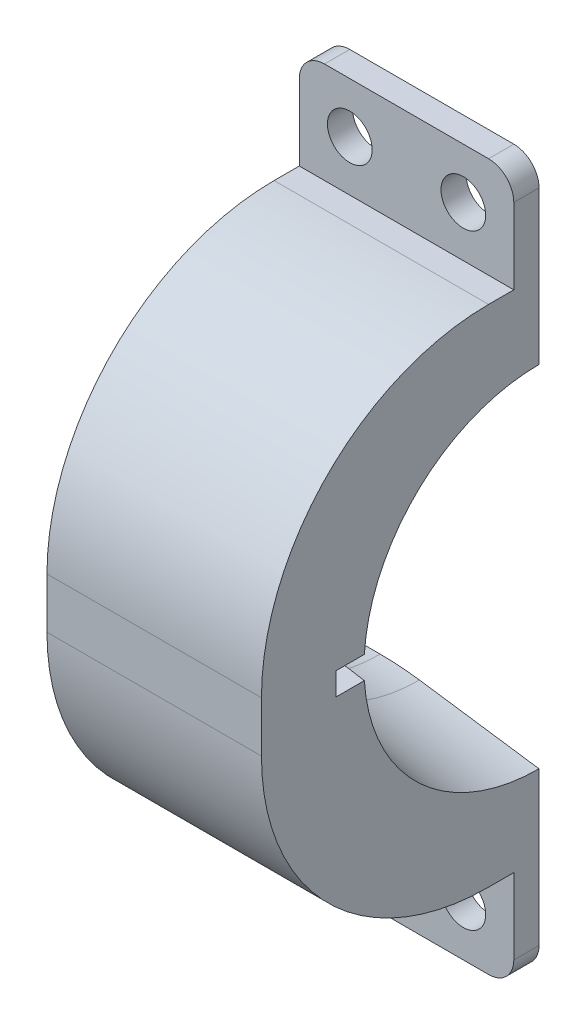
ISO-10303-21;
HEADER;
FILE_DESCRIPTION(('STEP AP214'),'2;1');
FILE_NAME('part.step','',(''),(''),'','','');
FILE_SCHEMA(('AUTOMOTIVE_DESIGN { 1 0 10303 214 1 1 1 1 }'));
ENDSEC;
DATA;
#1=APPLICATION_CONTEXT('core data for automotive mechanical design processes');
#2=APPLICATION_PROTOCOL_DEFINITION('international standard','automotive_design',2000,#1);
#3=PRODUCT_CONTEXT('',#1,'mechanical');
#4=PRODUCT('Part','Part','',(#3));
#5=PRODUCT_RELATED_PRODUCT_CATEGORY('part','',(#4));
#6=PRODUCT_DEFINITION_FORMATION('','',#4);
#7=PRODUCT_DEFINITION_CONTEXT('part definition',#1,'design');
#8=PRODUCT_DEFINITION('design','',#6,#7);
#9=PRODUCT_DEFINITION_SHAPE('','',#8);
#10=(LENGTH_UNIT() NAMED_UNIT(*) SI_UNIT(.MILLI.,.METRE.));
#11=(NAMED_UNIT(*) PLANE_ANGLE_UNIT() SI_UNIT($,.RADIAN.));
#12=(NAMED_UNIT(*) SI_UNIT($,.STERADIAN.) SOLID_ANGLE_UNIT());
#13=UNCERTAINTY_MEASURE_WITH_UNIT(LENGTH_MEASURE(1.E-05),#10,'distance_accuracy_value','');
#14=(GEOMETRIC_REPRESENTATION_CONTEXT(3) GLOBAL_UNCERTAINTY_ASSIGNED_CONTEXT((#13)) GLOBAL_UNIT_ASSIGNED_CONTEXT((#10,
#11,#12)) REPRESENTATION_CONTEXT('',''));
#15=CARTESIAN_POINT('',(0.,0.,0.));
#16=DIRECTION('',(0.,0.,1.));
#17=DIRECTION('',(1.,0.,0.));
#18=AXIS2_PLACEMENT_3D('',#15,#16,#17);
#19=CARTESIAN_POINT('',(4.46967704467682,25.4,27.94));
#20=DIRECTION('',(0.,-1.,0.));
#21=DIRECTION('',(1.,0.,0.));
#22=AXIS2_PLACEMENT_3D('',#19,#20,#21);
#23=PLANE('',#22);
#24=DIRECTION('',(-1.,0.,0.));
#25=VECTOR('',#24,1.);
#26=CARTESIAN_POINT('',(-89.5103229553232,25.4,2.54));
#27=LINE('',#26,#25);
#28=CARTESIAN_POINT('',(-67.9203229553232,25.4,2.54));
#29=VERTEX_POINT('',#28);
#30=CARTESIAN_POINT('',(-89.5103229553232,25.4,2.54));
#31=VERTEX_POINT('',#30);
#32=EDGE_CURVE('E390',#29,#31,#27,.T.);
#33=ORIENTED_EDGE('',*,*,#32,.T.);
#34=DIRECTION('',(0.,0.,-1.));
#35=VECTOR('',#34,1.);
#36=CARTESIAN_POINT('',(-89.5103229553232,25.4,27.94));
#37=LINE('',#36,#35);
#38=CARTESIAN_POINT('',(-89.5103229553232,25.4,5.08));
#39=VERTEX_POINT('',#38);
#40=EDGE_CURVE('E229',#39,#31,#37,.T.);
#41=ORIENTED_EDGE('',*,*,#40,.F.);
#42=DIRECTION('',(-1.,0.,0.));
#43=VECTOR('',#42,1.);
#44=CARTESIAN_POINT('',(4.46967704467682,25.4,5.08));
#45=LINE('',#44,#43);
#46=CARTESIAN_POINT('',(-67.9203229553232,25.4,5.08));
#47=VERTEX_POINT('',#46);
#48=EDGE_CURVE('E250',#39,#47,#45,.F.);
#49=ORIENTED_EDGE('',*,*,#48,.T.);
#50=DIRECTION('',(0.,0.,-1.));
#51=VECTOR('',#50,1.);
#52=CARTESIAN_POINT('',(-67.9203229553232,25.4,27.94));
#53=LINE('',#52,#51);
#54=EDGE_CURVE('E224',#47,#29,#53,.T.);
#55=ORIENTED_EDGE('',*,*,#54,.T.);
#56=EDGE_LOOP('',(#33,#41,#49,#55));
#57=FACE_BOUND('',#56,.T.);
#58=ADVANCED_FACE('F40',(#57),#23,.F.);
#59=CARTESIAN_POINT('',(0.,0.,0.));
#60=DIRECTION('',(0.,0.,-1.));
#61=DIRECTION('',(-1.,0.,0.));
#62=AXIS2_PLACEMENT_3D('',#59,#60,#61);
#63=PLANE('',#62);
#64=DIRECTION('',(0.989949493661167,0.141421356237309,0.));
#65=VECTOR('',#64,1.);
#66=CARTESIAN_POINT('',(-191.26581,0.,0.));
#67=LINE('',#66,#65);
#68=CARTESIAN_POINT('',(-67.9203229553232,17.6207838635253,0.));
#69=VERTEX_POINT('',#68);
#70=CARTESIAN_POINT('',(-79.9531319702509,15.901811147107,0.));
#71=VERTEX_POINT('',#70);
#72=EDGE_CURVE('E234',#69,#71,#67,.F.);
#73=ORIENTED_EDGE('',*,*,#72,.T.);
#74=CARTESIAN_POINT('',(-83.9044446635213,43.561,0.));
#75=DIRECTION('',(0.,0.,-1.));
#76=DIRECTION('',(-1.,0.,0.));
#77=AXIS2_PLACEMENT_3D('',#74,#75,#76);
#78=CIRCLE('',#77,27.94);
#79=CARTESIAN_POINT('',(-83.9044446635213,15.621,0.));
#80=VERTEX_POINT('',#79);
#81=EDGE_CURVE('E11',#71,#80,#78,.T.);
#82=ORIENTED_EDGE('',*,*,#81,.T.);
#83=DIRECTION('',(-1.,0.,0.));
#84=VECTOR('',#83,1.);
#85=CARTESIAN_POINT('',(-74.2703229553232,15.621,0.));
#86=LINE('',#85,#84);
#87=CARTESIAN_POINT('',(-89.5103229553232,15.621,0.));
#88=VERTEX_POINT('',#87);
#89=EDGE_CURVE('E198',#88,#80,#86,.F.);
#90=ORIENTED_EDGE('',*,*,#89,.F.);
#91=DIRECTION('',(0.,-1.,0.));
#92=VECTOR('',#91,1.);
#93=CARTESIAN_POINT('',(-89.5103229553232,25.4,0.));
#94=LINE('',#93,#92);
#95=CARTESIAN_POINT('',(-89.5103229553232,33.02,0.));
#96=VERTEX_POINT('',#95);
#97=EDGE_CURVE('E209',#96,#88,#94,.T.);
#98=ORIENTED_EDGE('',*,*,#97,.F.);
#99=CARTESIAN_POINT('',(-86.9703229553232,33.02,0.));
#100=DIRECTION('',(0.,0.,-1.));
#101=DIRECTION('',(-1.,0.,0.));
#102=AXIS2_PLACEMENT_3D('',#99,#100,#101);
#103=CIRCLE('',#102,2.54);
#104=CARTESIAN_POINT('',(-86.9703229553232,35.56,0.));
#105=VERTEX_POINT('',#104);
#106=EDGE_CURVE('E285',#96,#105,#103,.T.);
#107=ORIENTED_EDGE('',*,*,#106,.T.);
#108=DIRECTION('',(1.,0.,0.));
#109=VECTOR('',#108,1.);
#110=CARTESIAN_POINT('',(-89.5103229553232,35.56,0.));
#111=LINE('',#110,#109);
#112=CARTESIAN_POINT('',(-70.4603229553232,35.56,0.));
#113=VERTEX_POINT('',#112);
#114=EDGE_CURVE('E372',#105,#113,#111,.T.);
#115=ORIENTED_EDGE('',*,*,#114,.T.);
#116=CARTESIAN_POINT('',(-70.4603229553232,33.02,0.));
#117=DIRECTION('',(0.,0.,-1.));
#118=DIRECTION('',(-1.,0.,0.));
#119=AXIS2_PLACEMENT_3D('',#116,#117,#118);
#120=CIRCLE('',#119,2.54);
#121=CARTESIAN_POINT('',(-67.9203229553232,33.02,0.));
#122=VERTEX_POINT('',#121);
#123=EDGE_CURVE('E287',#113,#122,#120,.T.);
#124=ORIENTED_EDGE('',*,*,#123,.T.);
#125=DIRECTION('',(0.,1.,0.));
#126=VECTOR('',#125,1.);
#127=CARTESIAN_POINT('',(-67.9203229553232,25.4,0.));
#128=LINE('',#127,#126);
#129=EDGE_CURVE('E392',#69,#122,#128,.T.);
#130=ORIENTED_EDGE('',*,*,#129,.F.);
#131=EDGE_LOOP('',(#73,#82,#90,#98,#107,#115,#124,#130));
#132=FACE_BOUND('',#131,.T.);
#133=CARTESIAN_POINT('',(-73.0003229553232,30.48,0.));
#134=DIRECTION('',(0.,0.,1.));
#135=DIRECTION('',(1.,0.,0.));
#136=AXIS2_PLACEMENT_3D('',#133,#134,#135);
#137=CIRCLE('',#136,2.249999945);
#138=CARTESIAN_POINT('',(-70.7503230103232,30.48,0.));
#139=VERTEX_POINT('',#138);
#140=EDGE_CURVE('E355',#139,#139,#137,.T.);
#141=ORIENTED_EDGE('',*,*,#140,.T.);
#142=EDGE_LOOP('',(#141));
#143=FACE_BOUND('',#142,.T.);
#144=CARTESIAN_POINT('',(-84.4303229553232,30.48,0.));
#145=DIRECTION('',(0.,0.,1.));
#146=DIRECTION('',(1.,0.,0.));
#147=AXIS2_PLACEMENT_3D('',#144,#145,#146);
#148=CIRCLE('',#147,2.249999945);
#149=CARTESIAN_POINT('',(-82.1803230103232,30.48,0.));
#150=VERTEX_POINT('',#149);
#151=EDGE_CURVE('E363',#150,#150,#148,.T.);
#152=ORIENTED_EDGE('',*,*,#151,.T.);
#153=EDGE_LOOP('',(#152));
#154=FACE_BOUND('',#153,.T.);
#155=ADVANCED_FACE('F207',(#132,#143,#154),#63,.T.);
#156=DIRECTION('',(-1.,0.,0.));
#157=VECTOR('',#156,1.);
#158=CARTESIAN_POINT('',(-74.2703229553232,-15.621,0.));
#159=LINE('',#158,#157);
#160=CARTESIAN_POINT('',(-83.9044446635213,-15.621,0.));
#161=VERTEX_POINT('',#160);
#162=CARTESIAN_POINT('',(-89.5103229553232,-15.621,0.));
#163=VERTEX_POINT('',#162);
#164=EDGE_CURVE('E200',#161,#163,#159,.T.);
#165=ORIENTED_EDGE('',*,*,#164,.F.);
#166=CARTESIAN_POINT('',(-83.9044446635213,-43.561,0.));
#167=DIRECTION('',(0.,0.,-1.));
#168=DIRECTION('',(-1.,0.,0.));
#169=AXIS2_PLACEMENT_3D('',#166,#167,#168);
#170=CIRCLE('',#169,27.94);
#171=CARTESIAN_POINT('',(-79.9531319702509,-15.901811147107,0.));
#172=VERTEX_POINT('',#171);
#173=EDGE_CURVE('E62',#161,#172,#170,.T.);
#174=ORIENTED_EDGE('',*,*,#173,.T.);
#175=DIRECTION('',(-0.989949493661167,0.141421356237309,0.));
#176=VECTOR('',#175,1.);
#177=CARTESIAN_POINT('',(-191.26581,0.,0.));
#178=LINE('',#177,#176);
#179=CARTESIAN_POINT('',(-67.9203229553232,-17.6207838635253,0.));
#180=VERTEX_POINT('',#179);
#181=EDGE_CURVE('E232',#172,#180,#178,.F.);
#182=ORIENTED_EDGE('',*,*,#181,.T.);
#183=CARTESIAN_POINT('',(-67.9203229553232,-33.02,0.));
#184=VERTEX_POINT('',#183);
#185=EDGE_CURVE('E399',#184,#180,#128,.T.);
#186=ORIENTED_EDGE('',*,*,#185,.F.);
#187=CARTESIAN_POINT('',(-70.4603229553232,-33.02,0.));
#188=DIRECTION('',(0.,0.,-1.));
#189=DIRECTION('',(-1.,0.,0.));
#190=AXIS2_PLACEMENT_3D('',#187,#188,#189);
#191=CIRCLE('',#190,2.54);
#192=CARTESIAN_POINT('',(-70.4603229553232,-35.56,0.));
#193=VERTEX_POINT('',#192);
#194=EDGE_CURVE('E263',#184,#193,#191,.T.);
#195=ORIENTED_EDGE('',*,*,#194,.T.);
#196=DIRECTION('',(-1.,0.,0.));
#197=VECTOR('',#196,1.);
#198=CARTESIAN_POINT('',(-89.5103229553232,-35.56,0.));
#199=LINE('',#198,#197);
#200=CARTESIAN_POINT('',(-86.9703229553232,-35.56,0.));
#201=VERTEX_POINT('',#200);
#202=EDGE_CURVE('E369',#193,#201,#199,.T.);
#203=ORIENTED_EDGE('',*,*,#202,.T.);
#204=CARTESIAN_POINT('',(-86.9703229553232,-33.02,0.));
#205=DIRECTION('',(0.,0.,-1.));
#206=DIRECTION('',(-1.,0.,0.));
#207=AXIS2_PLACEMENT_3D('',#204,#205,#206);
#208=CIRCLE('',#207,2.54);
#209=CARTESIAN_POINT('',(-89.5103229553232,-33.02,0.));
#210=VERTEX_POINT('',#209);
#211=EDGE_CURVE('E265',#201,#210,#208,.T.);
#212=ORIENTED_EDGE('',*,*,#211,.T.);
#213=EDGE_CURVE('E219',#163,#210,#94,.T.);
#214=ORIENTED_EDGE('',*,*,#213,.F.);
#215=EDGE_LOOP('',(#165,#174,#182,#186,#195,#203,#212,#214));
#216=FACE_BOUND('',#215,.T.);
#217=CARTESIAN_POINT('',(-84.4303229553232,-30.48,0.));
#218=DIRECTION('',(0.,0.,1.));
#219=DIRECTION('',(1.,0.,0.));
#220=AXIS2_PLACEMENT_3D('',#217,#218,#219);
#221=CIRCLE('',#220,2.249999945);
#222=CARTESIAN_POINT('',(-82.1803230103232,-30.48,0.));
#223=VERTEX_POINT('',#222);
#224=EDGE_CURVE('E348',#223,#223,#221,.T.);
#225=ORIENTED_EDGE('',*,*,#224,.T.);
#226=EDGE_LOOP('',(#225));
#227=FACE_BOUND('',#226,.T.);
#228=CARTESIAN_POINT('',(-73.0003229553232,-30.48,0.));
#229=DIRECTION('',(0.,0.,1.));
#230=DIRECTION('',(1.,0.,0.));
#231=AXIS2_PLACEMENT_3D('',#228,#229,#230);
#232=CIRCLE('',#231,2.249999945);
#233=CARTESIAN_POINT('',(-70.7503230103232,-30.48,0.));
#234=VERTEX_POINT('',#233);
#235=EDGE_CURVE('E344',#234,#234,#232,.T.);
#236=ORIENTED_EDGE('',*,*,#235,.T.);
#237=EDGE_LOOP('',(#236));
#238=FACE_BOUND('',#237,.T.);
#239=ADVANCED_FACE('F454',(#216,#227,#238),#63,.T.);
#240=CARTESIAN_POINT('',(-89.5103229553232,25.4,27.94));
#241=DIRECTION('',(1.,0.,0.));
#242=DIRECTION('',(0.,0.,-1.));
#243=AXIS2_PLACEMENT_3D('',#240,#241,#242);
#244=PLANE('',#243);
#245=ORIENTED_EDGE('',*,*,#97,.T.);
#246=CARTESIAN_POINT('',(-89.5103229553232,0.,0.));
#247=DIRECTION('',(-1.,0.,0.));
#248=DIRECTION('',(0.,0.,1.));
#249=AXIS2_PLACEMENT_3D('',#246,#247,#248);
#250=CIRCLE('',#249,15.621);
#251=EDGE_CURVE('E194',#163,#88,#250,.T.);
#252=ORIENTED_EDGE('',*,*,#251,.F.);
#253=ORIENTED_EDGE('',*,*,#213,.T.);
#254=DIRECTION('',(0.,0.,-1.));
#255=VECTOR('',#254,1.);
#256=CARTESIAN_POINT('',(-89.5103229553232,-33.02,2.54));
#257=LINE('',#256,#255);
#258=CARTESIAN_POINT('',(-89.5103229553232,-33.02,2.54));
#259=VERTEX_POINT('',#258);
#260=EDGE_CURVE('E269',#210,#259,#257,.F.);
#261=ORIENTED_EDGE('',*,*,#260,.T.);
#262=DIRECTION('',(0.,1.,0.));
#263=VECTOR('',#262,1.);
#264=CARTESIAN_POINT('',(-89.5103229553232,-25.4,2.54));
#265=LINE('',#264,#263);
#266=CARTESIAN_POINT('',(-89.5103229553232,-25.4,2.54));
#267=VERTEX_POINT('',#266);
#268=EDGE_CURVE('E373',#259,#267,#265,.T.);
#269=ORIENTED_EDGE('',*,*,#268,.T.);
#270=DIRECTION('',(0.,0.,-1.));
#271=VECTOR('',#270,1.);
#272=CARTESIAN_POINT('',(-89.5103229553232,-25.4,27.94));
#273=LINE('',#272,#271);
#274=CARTESIAN_POINT('',(-89.5103229553232,-25.4,5.08));
#275=VERTEX_POINT('',#274);
#276=EDGE_CURVE('E222',#275,#267,#273,.T.);
#277=ORIENTED_EDGE('',*,*,#276,.F.);
#278=CARTESIAN_POINT('',(-89.5103229553232,-2.53999999999999,5.08));
#279=DIRECTION('',(1.,0.,0.));
#280=DIRECTION('',(0.,0.,-1.));
#281=AXIS2_PLACEMENT_3D('',#278,#279,#280);
#282=CIRCLE('',#281,22.86);
#283=CARTESIAN_POINT('',(-89.5103229553232,-2.53999999999999,27.94));
#284=VERTEX_POINT('',#283);
#285=EDGE_CURVE('E246',#275,#284,#282,.F.);
#286=ORIENTED_EDGE('',*,*,#285,.T.);
#287=DIRECTION('',(0.,-1.,0.));
#288=VECTOR('',#287,1.);
#289=CARTESIAN_POINT('',(-89.5103229553232,25.4,27.94));
#290=LINE('',#289,#288);
#291=CARTESIAN_POINT('',(-89.5103229553232,2.53999999999999,27.94));
#292=VERTEX_POINT('',#291);
#293=EDGE_CURVE('E218',#292,#284,#290,.T.);
#294=ORIENTED_EDGE('',*,*,#293,.F.);
#295=CARTESIAN_POINT('',(-89.5103229553232,2.53999999999999,5.08));
#296=DIRECTION('',(1.,0.,0.));
#297=DIRECTION('',(0.,0.,-1.));
#298=AXIS2_PLACEMENT_3D('',#295,#296,#297);
#299=CIRCLE('',#298,22.86);
#300=EDGE_CURVE('E248',#292,#39,#299,.F.);
#301=ORIENTED_EDGE('',*,*,#300,.T.);
#302=ORIENTED_EDGE('',*,*,#40,.T.);
#303=DIRECTION('',(0.,1.,0.));
#304=VECTOR('',#303,1.);
#305=CARTESIAN_POINT('',(-89.5103229553232,25.4,2.54));
#306=LINE('',#305,#304);
#307=CARTESIAN_POINT('',(-89.5103229553232,33.02,2.54));
#308=VERTEX_POINT('',#307);
#309=EDGE_CURVE('E383',#31,#308,#306,.T.);
#310=ORIENTED_EDGE('',*,*,#309,.T.);
#311=DIRECTION('',(0.,0.,-1.));
#312=VECTOR('',#311,1.);
#313=CARTESIAN_POINT('',(-89.5103229553232,33.02,0.));
#314=LINE('',#313,#312);
#315=EDGE_CURVE('E217',#308,#96,#314,.T.);
#316=ORIENTED_EDGE('',*,*,#315,.T.);
#317=EDGE_LOOP('',(#245,#252,#253,#261,#269,#277,#286,#294,#301,#302,#310,#316));
#318=FACE_BOUND('',#317,.T.);
#319=ADVANCED_FACE('F214',(#318),#244,.F.);
#320=CARTESIAN_POINT('',(4.46967704467682,-25.4,27.94));
#321=DIRECTION('',(0.,1.,0.));
#322=DIRECTION('',(-1.,0.,0.));
#323=AXIS2_PLACEMENT_3D('',#320,#321,#322);
#324=PLANE('',#323);
#325=ORIENTED_EDGE('',*,*,#276,.T.);
#326=DIRECTION('',(1.,0.,0.));
#327=VECTOR('',#326,1.);
#328=CARTESIAN_POINT('',(-89.5103229553232,-25.4,2.54));
#329=LINE('',#328,#327);
#330=CARTESIAN_POINT('',(-67.9203229553232,-25.4,2.54));
#331=VERTEX_POINT('',#330);
#332=EDGE_CURVE('E379',#267,#331,#329,.T.);
#333=ORIENTED_EDGE('',*,*,#332,.T.);
#334=DIRECTION('',(0.,0.,-1.));
#335=VECTOR('',#334,1.);
#336=CARTESIAN_POINT('',(-67.9203229553232,-25.4,27.94));
#337=LINE('',#336,#335);
#338=CARTESIAN_POINT('',(-67.9203229553232,-25.4,5.08));
#339=VERTEX_POINT('',#338);
#340=EDGE_CURVE('E398',#339,#331,#337,.T.);
#341=ORIENTED_EDGE('',*,*,#340,.F.);
#342=DIRECTION('',(1.,0.,0.));
#343=VECTOR('',#342,1.);
#344=CARTESIAN_POINT('',(4.46967704467682,-25.4,5.08));
#345=LINE('',#344,#343);
#346=EDGE_CURVE('E256',#339,#275,#345,.F.);
#347=ORIENTED_EDGE('',*,*,#346,.T.);
#348=EDGE_LOOP('',(#325,#333,#341,#347));
#349=FACE_BOUND('',#348,.T.);
#350=ADVANCED_FACE('F412',(#349),#324,.F.);
#351=CARTESIAN_POINT('',(0.,0.,27.94));
#352=DIRECTION('',(0.,0.,-1.));
#353=DIRECTION('',(-1.,0.,0.));
#354=AXIS2_PLACEMENT_3D('',#351,#352,#353);
#355=PLANE('',#354);
#356=DIRECTION('',(0.,1.,0.));
#357=VECTOR('',#356,1.);
#358=CARTESIAN_POINT('',(-67.9203229553232,25.4,27.94));
#359=LINE('',#358,#357);
#360=CARTESIAN_POINT('',(-67.9203229553232,-2.53999999999999,27.94));
#361=VERTEX_POINT('',#360);
#362=CARTESIAN_POINT('',(-67.9203229553232,2.53999999999999,27.94));
#363=VERTEX_POINT('',#362);
#364=EDGE_CURVE('E395',#361,#363,#359,.T.);
#365=ORIENTED_EDGE('',*,*,#364,.T.);
#366=DIRECTION('',(-1.,0.,0.));
#367=VECTOR('',#366,1.);
#368=CARTESIAN_POINT('',(0.,2.54,27.94));
#369=LINE('',#368,#367);
#370=EDGE_CURVE('E243',#363,#292,#369,.T.);
#371=ORIENTED_EDGE('',*,*,#370,.T.);
#372=ORIENTED_EDGE('',*,*,#293,.T.);
#373=DIRECTION('',(1.,0.,0.));
#374=VECTOR('',#373,1.);
#375=CARTESIAN_POINT('',(0.,-2.53999999999998,27.94));
#376=LINE('',#375,#374);
#377=EDGE_CURVE('E240',#284,#361,#376,.T.);
#378=ORIENTED_EDGE('',*,*,#377,.T.);
#379=EDGE_LOOP('',(#365,#371,#372,#378));
#380=FACE_BOUND('',#379,.T.);
#381=ADVANCED_FACE('F421',(#380),#355,.F.);
#382=CARTESIAN_POINT('',(-66.58356,0.,0.));
#383=DIRECTION('',(1.,0.,0.));
#384=DIRECTION('',(0.,1.,0.));
#385=AXIS2_PLACEMENT_3D('',#382,#383,#384);
#386=CONICAL_SURFACE('',#385,17.81175,0.141897054604164);
#387=ORIENTED_EDGE('',*,*,#181,.F.);
#388=CARTESIAN_POINT('',(-79.9531319702509,0.,0.));
#389=DIRECTION('',(1.,0.,0.));
#390=DIRECTION('',(0.,0.,-1.));
#391=AXIS2_PLACEMENT_3D('',#388,#389,#390);
#392=CIRCLE('',#391,15.901811147107);
#393=EDGE_CURVE('E48',#172,#71,#392,.F.);
#394=ORIENTED_EDGE('',*,*,#393,.T.);
#395=ORIENTED_EDGE('',*,*,#72,.F.);
#396=CARTESIAN_POINT('',(-67.9203229553232,0.,0.));
#397=DIRECTION('',(-1.,0.,0.));
#398=DIRECTION('',(0.,0.,1.));
#399=AXIS2_PLACEMENT_3D('',#396,#397,#398);
#400=CIRCLE('',#399,17.6207838635253);
#401=CARTESIAN_POINT('',(-67.9203229553232,1.143,17.5836735344203));
#402=VERTEX_POINT('',#401);
#403=EDGE_CURVE('E236',#402,#69,#400,.T.);
#404=ORIENTED_EDGE('',*,*,#403,.F.);
#405=CARTESIAN_POINT('',(-83.2279578981373,1.143,15.3915968895991));
#406=CARTESIAN_POINT('',(-79.3954465580823,1.143,15.9405804529348));
#407=CARTESIAN_POINT('',(-75.5629183974125,1.143,16.4894465385013));
#408=CARTESIAN_POINT('',(-67.8978284355364,1.143,17.5869437539965));
#409=CARTESIAN_POINT('',(-64.06526663433,1.143,18.1355748839253));
#410=CARTESIAN_POINT('',(-60.232688012509,1.143,18.6840885360849));
#411=B_SPLINE_CURVE_WITH_KNOTS('',3,(#405,#406,#407,#408,#409,#410),.UNSPECIFIED.,.F.,.F.,(4,2,
4),(0.,11.6148927993291,23.2297855965587),.UNSPECIFIED.);
#412=CARTESIAN_POINT('',(-74.7572716366464,1.143,16.6047838635253));
#413=VERTEX_POINT('',#412);
#414=EDGE_CURVE('E335',#413,#402,#411,.T.);
#415=ORIENTED_EDGE('',*,*,#414,.F.);
#416=CARTESIAN_POINT('',(-59.9646093955334,-8.72456275684632,16.6047838635253));
#417=CARTESIAN_POINT('',(-60.532181859697,-8.5501494566992,16.6047838635253));
#418=CARTESIAN_POINT('',(-61.0986817662019,-8.37214656604443,16.6047838635253));
#419=CARTESIAN_POINT('',(-62.2292223817507,-8.0070788906224,16.6047838635253));
#420=CARTESIAN_POINT('',(-62.793260905193,-7.82000734971015,16.6047838635253));
#421=CARTESIAN_POINT('',(-63.9303722312166,-7.43084256601658,16.6047838635253));
#422=CARTESIAN_POINT('',(-64.5033622099753,-7.2285058179676,16.6047838635253));
#423=CARTESIAN_POINT('',(-65.6439432474748,-6.81003310760305,16.6047838635253));
#424=CARTESIAN_POINT('',(-66.2115370996438,-6.59390478827498,16.6047838635253));
#425=CARTESIAN_POINT('',(-67.3398943476994,-6.14382660849172,16.6047838635253));
#426=CARTESIAN_POINT('',(-67.90065578822,-5.90987177906268,16.6047838635253));
#427=CARTESIAN_POINT('',(-68.734394462788,-5.54091204332956,16.6047838635253));
#428=CARTESIAN_POINT('',(-69.0113095588567,-5.41480407416728,16.6047838635253));
#429=CARTESIAN_POINT('',(-69.5618030566032,-5.15552336237338,16.6047838635253));
#430=CARTESIAN_POINT('',(-69.8353817130917,-5.02235116345984,16.6047838635253));
#431=CARTESIAN_POINT('',(-70.3764926952824,-4.74845614266283,16.6047838635253));
#432=CARTESIAN_POINT('',(-70.6440529622423,-4.60778877497455,16.6047838635253));
#433=CARTESIAN_POINT('',(-71.1735613374838,-4.31631125101994,16.6047838635253));
#434=CARTESIAN_POINT('',(-71.4355106275148,-4.16550325876347,16.6047838635253));
#435=CARTESIAN_POINT('',(-71.951060697169,-3.85164706521854,16.6047838635253));
#436=CARTESIAN_POINT('',(-72.2046819586016,-3.68863273061136,16.6047838635253));
#437=CARTESIAN_POINT('',(-72.7008423873873,-3.34665338156591,16.6047838635253));
#438=CARTESIAN_POINT('',(-72.9433910346777,-3.16770241411387,16.6047838635253));
#439=CARTESIAN_POINT('',(-73.3100564716272,-2.87096147789526,16.6047838635253));
#440=CARTESIAN_POINT('',(-73.4399244686291,-2.76029600167749,16.6047838635253));
#441=CARTESIAN_POINT('',(-73.6925799273337,-2.5309165577937,16.6047838635253));
#442=CARTESIAN_POINT('',(-73.8153626803032,-2.41219734920446,16.6047838635253));
#443=CARTESIAN_POINT('',(-74.0505023788271,-2.16619584513233,16.6047838635253));
#444=CARTESIAN_POINT('',(-74.1629208498636,-2.03897302207926,16.6047838635253));
#445=CARTESIAN_POINT('',(-74.3744604317863,-1.77402761073172,16.6047838635253));
#446=CARTESIAN_POINT('',(-74.4736007750056,-1.63632067175317,16.6047838635253));
#447=CARTESIAN_POINT('',(-74.6448947929535,-1.3630062400353,16.6047838635253));
#448=CARTESIAN_POINT('',(-74.7187263423468,-1.22846885887791,16.6047838635253));
#449=CARTESIAN_POINT('',(-74.8462964867971,-0.950003540602077,16.6047838635253));
#450=CARTESIAN_POINT('',(-74.9000426511227,-0.806079165080103,16.6047838635253));
#451=CARTESIAN_POINT('',(-74.9823460411115,-0.509221875512442,16.6047838635253));
#452=CARTESIAN_POINT('',(-75.0106157294259,-0.356206409558587,16.6047838635253));
#453=CARTESIAN_POINT('',(-75.03684459256,-0.0476137957336035,16.6047838635253));
#454=CARTESIAN_POINT('',(-75.034829797829,0.107961037384871,16.6047838635253));
#455=CARTESIAN_POINT('',(-75.0028629599449,0.398045155240693,16.6047838635253));
#456=CARTESIAN_POINT('',(-74.9761291431074,0.53293040167164,16.6047838635253));
#457=CARTESIAN_POINT('',(-74.902213798534,0.796894550030227,16.6047838635253));
#458=CARTESIAN_POINT('',(-74.8550210314963,0.925970217330864,16.6047838635253));
#459=CARTESIAN_POINT('',(-74.7129084613026,1.2473006689138,16.6047838635253));
#460=CARTESIAN_POINT('',(-74.6060758242616,1.4342298980958,16.6047838635253));
#461=CARTESIAN_POINT('',(-74.3655588132459,1.78995417585098,16.6047838635253));
#462=CARTESIAN_POINT('',(-74.2317837972137,1.95868497552008,16.6047838635253));
#463=CARTESIAN_POINT('',(-73.911996654208,2.31949814731429,16.6047838635253));
#464=CARTESIAN_POINT('',(-73.7211955513063,2.50726703566679,16.6047838635253));
#465=CARTESIAN_POINT('',(-73.3225272636101,2.86396333290063,16.6047838635253));
#466=CARTESIAN_POINT('',(-73.1146280872249,3.03285396007724,16.6047838635253));
#467=CARTESIAN_POINT('',(-72.685063096019,3.35768784984228,16.6047838635253));
#468=CARTESIAN_POINT('',(-72.4632600723588,3.51344762480291,16.6047838635253));
#469=CARTESIAN_POINT('',(-72.0119436467254,3.81271919706478,16.6047838635253));
#470=CARTESIAN_POINT('',(-71.7824381092486,3.95624298746796,16.6047838635253));
#471=CARTESIAN_POINT('',(-71.3145099118267,4.23542557084644,16.6047838635253));
#472=CARTESIAN_POINT('',(-71.0760086302249,4.37095173546933,16.6047838635253));
#473=CARTESIAN_POINT('',(-70.5945034242228,4.63378543024079,16.6047838635253));
#474=CARTESIAN_POINT('',(-70.3514988409375,4.76109174531517,16.6047838635253));
#475=CARTESIAN_POINT('',(-69.6170176868855,5.13291200792459,16.6047838635253));
#476=CARTESIAN_POINT('',(-69.1203511732301,5.36716679151515,16.6047838635253));
#477=CARTESIAN_POINT('',(-68.1163489730882,5.81655277795707,16.6047838635253));
#478=CARTESIAN_POINT('',(-67.6089801682028,6.0316086920941,16.6047838635253));
#479=CARTESIAN_POINT('',(-66.5881778718693,6.44621731960819,16.6047838635253));
#480=CARTESIAN_POINT('',(-66.0747465057889,6.64577529052715,16.6047838635253));
#481=CARTESIAN_POINT('',(-65.0965118061986,7.01270851495886,16.6047838635253));
#482=CARTESIAN_POINT('',(-64.6321541209329,7.18128032888108,16.6047838635253));
#483=CARTESIAN_POINT('',(-63.7005056721534,7.51025363044038,16.6047838635253));
#484=CARTESIAN_POINT('',(-63.2332146073994,7.67065426300315,16.6047838635253));
#485=CARTESIAN_POINT('',(-62.3000449867373,7.9832969539693,16.6047838635253));
#486=CARTESIAN_POINT('',(-61.8341846798986,8.13559368358751,16.6047838635253));
#487=CARTESIAN_POINT('',(-60.9006688618731,8.43427436080144,16.6047838635253));
#488=CARTESIAN_POINT('',(-60.4330137125063,8.58065943793976,16.6047838635253));
#489=CARTESIAN_POINT('',(-59.9646093955333,8.72456275684632,16.6047838635253));
#490=B_SPLINE_CURVE_WITH_KNOTS('',3,(#416,#417,#418,#419,#420,#421,#422,#423,#424,#425,#426,
#427,#428,#429,#430,#431,#432,#433,#434,#435,#436,#437,#438,#439,#440,#441,#442,#443,#444,#445,
#446,#447,#448,#449,#450,#451,#452,#453,#454,#455,#456,#457,#458,#459,#460,#461,#462,#463,#464,
#465,#466,#467,#468,#469,#470,#471,#472,#473,#474,#475,#476,#477,#478,#479,#480,#481,#482,#483,
#484,#485,#486,#487,#488,#489),.UNSPECIFIED.,.F.,.F.,(4,2,2,2,2,2,2,2,2,2,2,2,2,2,2,2,2,2,2,2,2,
2,2,2,2,2,2,2,2,2,2,2,2,2,2,2,4),(0.,1.78132999382055,3.56400810912257,5.38685645502716,
7.20870324669594,9.03105973211113,9.94381708137555,10.8565042793797,11.7631854835898,
12.6696738122897,13.5737341585323,14.4770053823339,14.9886228503211,15.5005765049085,
16.0092635120904,16.5172055683322,16.9763319778409,17.4352851885766,17.8993557071776,
18.3630273656516,18.7737229624604,19.1846444649343,19.8268267816431,20.4712068043921,
21.2724403595673,22.0752087554608,22.8877893630715,23.6995641367138,24.5223181699142,
25.3451935470865,26.991904335983,28.644812453868,30.2971573652148,31.7790986719503,
33.261194739395,34.7315218100017,36.2015666022409),.UNSPECIFIED.);
#491=CARTESIAN_POINT('',(-74.7572716366464,-1.143,16.6047838635253));
#492=VERTEX_POINT('',#491);
#493=EDGE_CURVE('E296',#492,#413,#490,.T.);
#494=ORIENTED_EDGE('',*,*,#493,.F.);
#495=CARTESIAN_POINT('',(-60.232688012509,-1.143,18.6840885360849));
#496=CARTESIAN_POINT('',(-64.06526663433,-1.143,18.1355748839253));
#497=CARTESIAN_POINT('',(-67.8978284355364,-1.143,17.5869437539965));
#498=CARTESIAN_POINT('',(-75.5629183974125,-1.143,16.4894465385013));
#499=CARTESIAN_POINT('',(-79.3954465580823,-1.143,15.9405804529348));
#500=CARTESIAN_POINT('',(-83.2279578981373,-1.143,15.3915968895991));
#501=B_SPLINE_CURVE_WITH_KNOTS('',3,(#495,#496,#497,#498,#499,#500),.UNSPECIFIED.,.F.,.F.,(4,2,
4),(0.,11.6148927972296,23.2297855965587),.UNSPECIFIED.);
#502=CARTESIAN_POINT('',(-67.9203229553232,-1.143,17.5836735344203));
#503=VERTEX_POINT('',#502);
#504=EDGE_CURVE('E328',#503,#492,#501,.T.);
#505=ORIENTED_EDGE('',*,*,#504,.F.);
#506=EDGE_CURVE('E237',#180,#503,#400,.T.);
#507=ORIENTED_EDGE('',*,*,#506,.F.);
#508=EDGE_LOOP('',(#387,#394,#395,#404,#415,#494,#505,#507));
#509=FACE_BOUND('',#508,.T.);
#510=ADVANCED_FACE('F306',(#509),#386,.F.);
#511=CARTESIAN_POINT('',(-67.9203229553232,25.4,27.94));
#512=DIRECTION('',(-1.,0.,0.));
#513=DIRECTION('',(0.,0.,1.));
#514=AXIS2_PLACEMENT_3D('',#511,#512,#513);
#515=PLANE('',#514);
#516=DIRECTION('',(0.,-1.,0.));
#517=VECTOR('',#516,1.);
#518=CARTESIAN_POINT('',(-67.9203229553232,1.143,20.4147838635253));
#519=LINE('',#518,#517);
#520=CARTESIAN_POINT('',(-67.9203229553232,1.143,20.4147838635253));
#521=VERTEX_POINT('',#520);
#522=CARTESIAN_POINT('',(-67.9203229553232,-1.143,20.4147838635253));
#523=VERTEX_POINT('',#522);
#524=EDGE_CURVE('E211',#521,#523,#519,.T.);
#525=ORIENTED_EDGE('',*,*,#524,.F.);
#526=DIRECTION('',(0.,0.,-1.));
#527=VECTOR('',#526,1.);
#528=CARTESIAN_POINT('',(-67.9203229553232,1.143,27.94));
#529=LINE('',#528,#527);
#530=EDGE_CURVE('E293',#521,#402,#529,.T.);
#531=ORIENTED_EDGE('',*,*,#530,.T.);
#532=ORIENTED_EDGE('',*,*,#403,.T.);
#533=ORIENTED_EDGE('',*,*,#129,.T.);
#534=DIRECTION('',(0.,0.,-1.));
#535=VECTOR('',#534,1.);
#536=CARTESIAN_POINT('',(-67.9203229553232,33.02,2.54));
#537=LINE('',#536,#535);
#538=CARTESIAN_POINT('',(-67.9203229553232,33.02,2.54));
#539=VERTEX_POINT('',#538);
#540=EDGE_CURVE('E275',#122,#539,#537,.F.);
#541=ORIENTED_EDGE('',*,*,#540,.T.);
#542=DIRECTION('',(0.,-1.,0.));
#543=VECTOR('',#542,1.);
#544=CARTESIAN_POINT('',(-67.9203229553232,25.4,2.54));
#545=LINE('',#544,#543);
#546=EDGE_CURVE('E388',#539,#29,#545,.T.);
#547=ORIENTED_EDGE('',*,*,#546,.T.);
#548=ORIENTED_EDGE('',*,*,#54,.F.);
#549=CARTESIAN_POINT('',(-67.9203229553232,2.53999999999999,5.08));
#550=DIRECTION('',(-1.,0.,0.));
#551=DIRECTION('',(0.,0.,1.));
#552=AXIS2_PLACEMENT_3D('',#549,#550,#551);
#553=CIRCLE('',#552,22.86);
#554=EDGE_CURVE('E254',#47,#363,#553,.F.);
#555=ORIENTED_EDGE('',*,*,#554,.T.);
#556=ORIENTED_EDGE('',*,*,#364,.F.);
#557=CARTESIAN_POINT('',(-67.9203229553232,-2.53999999999999,5.08));
#558=DIRECTION('',(-1.,0.,0.));
#559=DIRECTION('',(0.,0.,1.));
#560=AXIS2_PLACEMENT_3D('',#557,#558,#559);
#561=CIRCLE('',#560,22.86);
#562=EDGE_CURVE('E252',#361,#339,#561,.F.);
#563=ORIENTED_EDGE('',*,*,#562,.T.);
#564=ORIENTED_EDGE('',*,*,#340,.T.);
#565=DIRECTION('',(0.,-1.,0.));
#566=VECTOR('',#565,1.);
#567=CARTESIAN_POINT('',(-67.9203229553232,-25.4,2.54));
#568=LINE('',#567,#566);
#569=CARTESIAN_POINT('',(-67.9203229553232,-33.02,2.54));
#570=VERTEX_POINT('',#569);
#571=EDGE_CURVE('E376',#331,#570,#568,.T.);
#572=ORIENTED_EDGE('',*,*,#571,.T.);
#573=DIRECTION('',(0.,0.,-1.));
#574=VECTOR('',#573,1.);
#575=CARTESIAN_POINT('',(-67.9203229553232,-33.02,0.));
#576=LINE('',#575,#574);
#577=EDGE_CURVE('E277',#570,#184,#576,.T.);
#578=ORIENTED_EDGE('',*,*,#577,.T.);
#579=ORIENTED_EDGE('',*,*,#185,.T.);
#580=ORIENTED_EDGE('',*,*,#506,.T.);
#581=DIRECTION('',(0.,0.,-1.));
#582=VECTOR('',#581,1.);
#583=CARTESIAN_POINT('',(-67.9203229553232,-1.143,20.4147838635253));
#584=LINE('',#583,#582);
#585=EDGE_CURVE('E462',#523,#503,#584,.T.);
#586=ORIENTED_EDGE('',*,*,#585,.F.);
#587=EDGE_LOOP('',(#525,#531,#532,#533,#541,#547,#548,#555,#556,#563,#564,#572,#578,#579,#580,#586));
#588=FACE_BOUND('',#587,.T.);
#589=ADVANCED_FACE('F407',(#588),#515,.F.);
#590=CARTESIAN_POINT('',(0.,2.54,5.08));
#591=DIRECTION('',(-1.,0.,0.));
#592=DIRECTION('',(0.,-1.,0.));
#593=AXIS2_PLACEMENT_3D('',#590,#591,#592);
#594=CYLINDRICAL_SURFACE('',#593,22.86);
#595=ORIENTED_EDGE('',*,*,#554,.F.);
#596=ORIENTED_EDGE('',*,*,#48,.F.);
#597=ORIENTED_EDGE('',*,*,#300,.F.);
#598=ORIENTED_EDGE('',*,*,#370,.F.);
#599=EDGE_LOOP('',(#595,#596,#597,#598));
#600=FACE_BOUND('',#599,.T.);
#601=ADVANCED_FACE('F425',(#600),#594,.T.);
#602=CARTESIAN_POINT('',(0.,-2.53999999999998,5.08));
#603=DIRECTION('',(1.,0.,0.));
#604=DIRECTION('',(0.,1.,0.));
#605=AXIS2_PLACEMENT_3D('',#602,#603,#604);
#606=CYLINDRICAL_SURFACE('',#605,22.86);
#607=ORIENTED_EDGE('',*,*,#285,.F.);
#608=ORIENTED_EDGE('',*,*,#346,.F.);
#609=ORIENTED_EDGE('',*,*,#562,.F.);
#610=ORIENTED_EDGE('',*,*,#377,.F.);
#611=EDGE_LOOP('',(#607,#608,#609,#610));
#612=FACE_BOUND('',#611,.T.);
#613=ADVANCED_FACE('F417',(#612),#606,.T.);
#614=CARTESIAN_POINT('',(-89.5103229553232,35.56,2.54));
#615=DIRECTION('',(0.,1.,0.));
#616=DIRECTION('',(0.,0.,1.));
#617=AXIS2_PLACEMENT_3D('',#614,#615,#616);
#618=PLANE('',#617);
#619=DIRECTION('',(1.,0.,0.));
#620=VECTOR('',#619,1.);
#621=CARTESIAN_POINT('',(-89.5103229553232,35.56,2.54));
#622=LINE('',#621,#620);
#623=CARTESIAN_POINT('',(-86.9703229553232,35.56,2.54));
#624=VERTEX_POINT('',#623);
#625=CARTESIAN_POINT('',(-70.4603229553232,35.56,2.54));
#626=VERTEX_POINT('',#625);
#627=EDGE_CURVE('E385',#624,#626,#622,.T.);
#628=ORIENTED_EDGE('',*,*,#627,.T.);
#629=DIRECTION('',(0.,0.,-1.));
#630=VECTOR('',#629,1.);
#631=CARTESIAN_POINT('',(-70.4603229553232,35.56,0.));
#632=LINE('',#631,#630);
#633=EDGE_CURVE('E282',#626,#113,#632,.T.);
#634=ORIENTED_EDGE('',*,*,#633,.T.);
#635=ORIENTED_EDGE('',*,*,#114,.F.);
#636=DIRECTION('',(0.,0.,-1.));
#637=VECTOR('',#636,1.);
#638=CARTESIAN_POINT('',(-86.9703229553232,35.56,2.54));
#639=LINE('',#638,#637);
#640=EDGE_CURVE('E280',#105,#624,#639,.F.);
#641=ORIENTED_EDGE('',*,*,#640,.T.);
#642=EDGE_LOOP('',(#628,#634,#635,#641));
#643=FACE_BOUND('',#642,.T.);
#644=ADVANCED_FACE('F443',(#643),#618,.T.);
#645=CARTESIAN_POINT('',(0.,0.,2.54));
#646=DIRECTION('',(0.,0.,-1.));
#647=DIRECTION('',(-1.,0.,0.));
#648=AXIS2_PLACEMENT_3D('',#645,#646,#647);
#649=PLANE('',#648);
#650=CARTESIAN_POINT('',(-73.0003229553232,30.48,2.54));
#651=DIRECTION('',(0.,0.,1.));
#652=DIRECTION('',(1.,0.,0.));
#653=AXIS2_PLACEMENT_3D('',#650,#651,#652);
#654=CIRCLE('',#653,2.249999945);
#655=CARTESIAN_POINT('',(-70.7503230103232,30.48,2.54));
#656=VERTEX_POINT('',#655);
#657=EDGE_CURVE('E351',#656,#656,#654,.T.);
#658=ORIENTED_EDGE('',*,*,#657,.F.);
#659=EDGE_LOOP('',(#658));
#660=FACE_BOUND('',#659,.T.);
#661=CARTESIAN_POINT('',(-84.4303229553232,30.48,2.54));
#662=DIRECTION('',(0.,0.,1.));
#663=DIRECTION('',(1.,0.,0.));
#664=AXIS2_PLACEMENT_3D('',#661,#662,#663);
#665=CIRCLE('',#664,2.249999945);
#666=CARTESIAN_POINT('',(-82.1803230103232,30.48,2.54));
#667=VERTEX_POINT('',#666);
#668=EDGE_CURVE('E354',#667,#667,#665,.T.);
#669=ORIENTED_EDGE('',*,*,#668,.F.);
#670=EDGE_LOOP('',(#669));
#671=FACE_BOUND('',#670,.T.);
#672=ORIENTED_EDGE('',*,*,#546,.F.);
#673=CARTESIAN_POINT('',(-70.4603229553232,33.02,2.54));
#674=DIRECTION('',(0.,0.,-1.));
#675=DIRECTION('',(-1.,0.,0.));
#676=AXIS2_PLACEMENT_3D('',#673,#674,#675);
#677=CIRCLE('',#676,2.54);
#678=EDGE_CURVE('E291',#539,#626,#677,.F.);
#679=ORIENTED_EDGE('',*,*,#678,.T.);
#680=ORIENTED_EDGE('',*,*,#627,.F.);
#681=CARTESIAN_POINT('',(-86.9703229553232,33.02,2.54));
#682=DIRECTION('',(0.,0.,-1.));
#683=DIRECTION('',(-1.,0.,0.));
#684=AXIS2_PLACEMENT_3D('',#681,#682,#683);
#685=CIRCLE('',#684,2.54);
#686=EDGE_CURVE('E289',#624,#308,#685,.F.);
#687=ORIENTED_EDGE('',*,*,#686,.T.);
#688=ORIENTED_EDGE('',*,*,#309,.F.);
#689=ORIENTED_EDGE('',*,*,#32,.F.);
#690=EDGE_LOOP('',(#672,#679,#680,#687,#688,#689));
#691=FACE_BOUND('',#690,.T.);
#692=ADVANCED_FACE('F434',(#660,#671,#691),#649,.F.);
#693=CARTESIAN_POINT('',(-89.5103229553232,-35.56,2.54));
#694=DIRECTION('',(0.,-1.,0.));
#695=DIRECTION('',(1.,0.,0.));
#696=AXIS2_PLACEMENT_3D('',#693,#694,#695);
#697=PLANE('',#696);
#698=DIRECTION('',(-1.,0.,0.));
#699=VECTOR('',#698,1.);
#700=CARTESIAN_POINT('',(-89.5103229553232,-35.56,2.54));
#701=LINE('',#700,#699);
#702=CARTESIAN_POINT('',(-70.4603229553232,-35.56,2.54));
#703=VERTEX_POINT('',#702);
#704=CARTESIAN_POINT('',(-86.9703229553232,-35.56,2.54));
#705=VERTEX_POINT('',#704);
#706=EDGE_CURVE('E366',#703,#705,#701,.T.);
#707=ORIENTED_EDGE('',*,*,#706,.T.);
#708=DIRECTION('',(0.,0.,-1.));
#709=VECTOR('',#708,1.);
#710=CARTESIAN_POINT('',(-86.9703229553232,-35.56,0.));
#711=LINE('',#710,#709);
#712=EDGE_CURVE('E260',#705,#201,#711,.T.);
#713=ORIENTED_EDGE('',*,*,#712,.T.);
#714=ORIENTED_EDGE('',*,*,#202,.F.);
#715=DIRECTION('',(0.,0.,-1.));
#716=VECTOR('',#715,1.);
#717=CARTESIAN_POINT('',(-70.4603229553232,-35.56,2.54));
#718=LINE('',#717,#716);
#719=EDGE_CURVE('E258',#193,#703,#718,.F.);
#720=ORIENTED_EDGE('',*,*,#719,.T.);
#721=EDGE_LOOP('',(#707,#713,#714,#720));
#722=FACE_BOUND('',#721,.T.);
#723=ADVANCED_FACE('F544',(#722),#697,.T.);
#724=CARTESIAN_POINT('',(0.,0.,2.54));
#725=DIRECTION('',(0.,0.,1.));
#726=DIRECTION('',(1.,0.,0.));
#727=AXIS2_PLACEMENT_3D('',#724,#725,#726);
#728=PLANE('',#727);
#729=CARTESIAN_POINT('',(-84.4303229553232,-30.48,2.54));
#730=DIRECTION('',(0.,0.,1.));
#731=DIRECTION('',(1.,0.,0.));
#732=AXIS2_PLACEMENT_3D('',#729,#730,#731);
#733=CIRCLE('',#732,2.249999945);
#734=CARTESIAN_POINT('',(-82.1803230103232,-30.48,2.54));
#735=VERTEX_POINT('',#734);
#736=EDGE_CURVE('E358',#735,#735,#733,.T.);
#737=ORIENTED_EDGE('',*,*,#736,.F.);
#738=EDGE_LOOP('',(#737));
#739=FACE_BOUND('',#738,.T.);
#740=CARTESIAN_POINT('',(-73.0003229553232,-30.48,2.54));
#741=DIRECTION('',(0.,0.,1.));
#742=DIRECTION('',(1.,0.,0.));
#743=AXIS2_PLACEMENT_3D('',#740,#741,#742);
#744=CIRCLE('',#743,2.249999945);
#745=CARTESIAN_POINT('',(-70.7503230103232,-30.48,2.54));
#746=VERTEX_POINT('',#745);
#747=EDGE_CURVE('E345',#746,#746,#744,.T.);
#748=ORIENTED_EDGE('',*,*,#747,.F.);
#749=EDGE_LOOP('',(#748));
#750=FACE_BOUND('',#749,.T.);
#751=ORIENTED_EDGE('',*,*,#268,.F.);
#752=CARTESIAN_POINT('',(-86.9703229553232,-33.02,2.54));
#753=DIRECTION('',(0.,0.,1.));
#754=DIRECTION('',(1.,0.,0.));
#755=AXIS2_PLACEMENT_3D('',#752,#753,#754);
#756=CIRCLE('',#755,2.54);
#757=EDGE_CURVE('E273',#259,#705,#756,.T.);
#758=ORIENTED_EDGE('',*,*,#757,.T.);
#759=ORIENTED_EDGE('',*,*,#706,.F.);
#760=CARTESIAN_POINT('',(-70.4603229553232,-33.02,2.54));
#761=DIRECTION('',(0.,0.,1.));
#762=DIRECTION('',(1.,0.,0.));
#763=AXIS2_PLACEMENT_3D('',#760,#761,#762);
#764=CIRCLE('',#763,2.54);
#765=EDGE_CURVE('E271',#703,#570,#764,.T.);
#766=ORIENTED_EDGE('',*,*,#765,.T.);
#767=ORIENTED_EDGE('',*,*,#571,.F.);
#768=ORIENTED_EDGE('',*,*,#332,.F.);
#769=EDGE_LOOP('',(#751,#758,#759,#766,#767,#768));
#770=FACE_BOUND('',#769,.T.);
#771=ADVANCED_FACE('F514',(#739,#750,#770),#728,.T.);
#772=CARTESIAN_POINT('',(-86.9703229553232,-33.02,2.54));
#773=DIRECTION('',(0.,0.,1.));
#774=DIRECTION('',(1.,0.,0.));
#775=AXIS2_PLACEMENT_3D('',#772,#773,#774);
#776=CYLINDRICAL_SURFACE('',#775,2.54);
#777=ORIENTED_EDGE('',*,*,#757,.F.);
#778=ORIENTED_EDGE('',*,*,#260,.F.);
#779=ORIENTED_EDGE('',*,*,#211,.F.);
#780=ORIENTED_EDGE('',*,*,#712,.F.);
#781=EDGE_LOOP('',(#777,#778,#779,#780));
#782=FACE_BOUND('',#781,.T.);
#783=ADVANCED_FACE('F510',(#782),#776,.T.);
#784=CARTESIAN_POINT('',(-70.4603229553232,-33.02,27.94));
#785=DIRECTION('',(0.,0.,1.));
#786=DIRECTION('',(1.,0.,0.));
#787=AXIS2_PLACEMENT_3D('',#784,#785,#786);
#788=CYLINDRICAL_SURFACE('',#787,2.54);
#789=ORIENTED_EDGE('',*,*,#765,.F.);
#790=ORIENTED_EDGE('',*,*,#719,.F.);
#791=ORIENTED_EDGE('',*,*,#194,.F.);
#792=ORIENTED_EDGE('',*,*,#577,.F.);
#793=EDGE_LOOP('',(#789,#790,#791,#792));
#794=FACE_BOUND('',#793,.T.);
#795=ADVANCED_FACE('F513',(#794),#788,.T.);
#796=CARTESIAN_POINT('',(-70.4603229553232,33.02,2.54));
#797=DIRECTION('',(0.,0.,1.));
#798=DIRECTION('',(1.,0.,0.));
#799=AXIS2_PLACEMENT_3D('',#796,#797,#798);
#800=CYLINDRICAL_SURFACE('',#799,2.54);
#801=ORIENTED_EDGE('',*,*,#678,.F.);
#802=ORIENTED_EDGE('',*,*,#540,.F.);
#803=ORIENTED_EDGE('',*,*,#123,.F.);
#804=ORIENTED_EDGE('',*,*,#633,.F.);
#805=EDGE_LOOP('',(#801,#802,#803,#804));
#806=FACE_BOUND('',#805,.T.);
#807=ADVANCED_FACE('F446',(#806),#800,.T.);
#808=CARTESIAN_POINT('',(-86.9703229553232,33.02,27.94));
#809=DIRECTION('',(0.,0.,1.));
#810=DIRECTION('',(1.,0.,0.));
#811=AXIS2_PLACEMENT_3D('',#808,#809,#810);
#812=CYLINDRICAL_SURFACE('',#811,2.54);
#813=ORIENTED_EDGE('',*,*,#686,.F.);
#814=ORIENTED_EDGE('',*,*,#640,.F.);
#815=ORIENTED_EDGE('',*,*,#106,.F.);
#816=ORIENTED_EDGE('',*,*,#315,.F.);
#817=EDGE_LOOP('',(#813,#814,#815,#816));
#818=FACE_BOUND('',#817,.T.);
#819=ADVANCED_FACE('F439',(#818),#812,.T.);
#820=CARTESIAN_POINT('',(-73.0003229553232,-30.48,0.));
#821=DIRECTION('',(0.,0.,1.));
#822=DIRECTION('',(1.,0.,0.));
#823=AXIS2_PLACEMENT_3D('',#820,#821,#822);
#824=CYLINDRICAL_SURFACE('',#823,2.249999945);
#825=ORIENTED_EDGE('',*,*,#235,.F.);
#826=EDGE_LOOP('',(#825));
#827=FACE_BOUND('',#826,.T.);
#828=ORIENTED_EDGE('',*,*,#747,.T.);
#829=EDGE_LOOP('',(#828));
#830=FACE_BOUND('',#829,.T.);
#831=ADVANCED_FACE('F521',(#827,#830),#824,.F.);
#832=CARTESIAN_POINT('',(-84.4303229553232,-30.48,0.));
#833=DIRECTION('',(0.,0.,1.));
#834=DIRECTION('',(1.,0.,0.));
#835=AXIS2_PLACEMENT_3D('',#832,#833,#834);
#836=CYLINDRICAL_SURFACE('',#835,2.249999945);
#837=ORIENTED_EDGE('',*,*,#224,.F.);
#838=EDGE_LOOP('',(#837));
#839=FACE_BOUND('',#838,.T.);
#840=ORIENTED_EDGE('',*,*,#736,.T.);
#841=EDGE_LOOP('',(#840));
#842=FACE_BOUND('',#841,.T.);
#843=ADVANCED_FACE('F526',(#839,#842),#836,.F.);
#844=CARTESIAN_POINT('',(-84.4303229553232,30.48,0.));
#845=DIRECTION('',(0.,0.,1.));
#846=DIRECTION('',(1.,0.,0.));
#847=AXIS2_PLACEMENT_3D('',#844,#845,#846);
#848=CYLINDRICAL_SURFACE('',#847,2.249999945);
#849=ORIENTED_EDGE('',*,*,#151,.F.);
#850=EDGE_LOOP('',(#849));
#851=FACE_BOUND('',#850,.T.);
#852=ORIENTED_EDGE('',*,*,#668,.T.);
#853=EDGE_LOOP('',(#852));
#854=FACE_BOUND('',#853,.T.);
#855=ADVANCED_FACE('F532',(#851,#854),#848,.F.);
#856=CARTESIAN_POINT('',(-73.0003229553232,30.48,0.));
#857=DIRECTION('',(0.,0.,1.));
#858=DIRECTION('',(1.,0.,0.));
#859=AXIS2_PLACEMENT_3D('',#856,#857,#858);
#860=CYLINDRICAL_SURFACE('',#859,2.249999945);
#861=ORIENTED_EDGE('',*,*,#140,.F.);
#862=EDGE_LOOP('',(#861));
#863=FACE_BOUND('',#862,.T.);
#864=ORIENTED_EDGE('',*,*,#657,.T.);
#865=EDGE_LOOP('',(#864));
#866=FACE_BOUND('',#865,.T.);
#867=ADVANCED_FACE('F495',(#863,#866),#860,.F.);
#868=CARTESIAN_POINT('',(-75.5403229553232,1.143,20.4147838635253));
#869=DIRECTION('',(0.,0.,1.));
#870=DIRECTION('',(1.,0.,0.));
#871=AXIS2_PLACEMENT_3D('',#868,#869,#870);
#872=PLANE('',#871);
#873=ORIENTED_EDGE('',*,*,#524,.T.);
#874=DIRECTION('',(1.,0.,0.));
#875=VECTOR('',#874,1.);
#876=CARTESIAN_POINT('',(-75.5403229553232,-1.143,20.4147838635253));
#877=LINE('',#876,#875);
#878=CARTESIAN_POINT('',(-75.5403229553232,-1.143,20.4147838635253));
#879=VERTEX_POINT('',#878);
#880=EDGE_CURVE('E337',#879,#523,#877,.T.);
#881=ORIENTED_EDGE('',*,*,#880,.F.);
#882=DIRECTION('',(0.,-1.,0.));
#883=VECTOR('',#882,1.);
#884=CARTESIAN_POINT('',(-75.5403229553232,1.143,20.4147838635253));
#885=LINE('',#884,#883);
#886=CARTESIAN_POINT('',(-75.5403229553232,1.143,20.4147838635253));
#887=VERTEX_POINT('',#886);
#888=EDGE_CURVE('E458',#887,#879,#885,.T.);
#889=ORIENTED_EDGE('',*,*,#888,.F.);
#890=DIRECTION('',(1.,0.,0.));
#891=VECTOR('',#890,1.);
#892=CARTESIAN_POINT('',(-75.5403229553232,1.143,20.4147838635253));
#893=LINE('',#892,#891);
#894=EDGE_CURVE('E336',#887,#521,#893,.T.);
#895=ORIENTED_EDGE('',*,*,#894,.T.);
#896=EDGE_LOOP('',(#873,#881,#889,#895));
#897=FACE_BOUND('',#896,.T.);
#898=ADVANCED_FACE('F325',(#897),#872,.F.);
#899=CARTESIAN_POINT('',(-75.5403229553232,1.143,20.4147838635253));
#900=DIRECTION('',(0.,1.,0.));
#901=DIRECTION('',(0.,0.,1.));
#902=AXIS2_PLACEMENT_3D('',#899,#900,#901);
#903=PLANE('',#902);
#904=ORIENTED_EDGE('',*,*,#414,.T.);
#905=ORIENTED_EDGE('',*,*,#530,.F.);
#906=ORIENTED_EDGE('',*,*,#894,.F.);
#907=DIRECTION('',(0.,0.,1.));
#908=VECTOR('',#907,1.);
#909=CARTESIAN_POINT('',(-75.5403229553232,1.143,20.4147838635253));
#910=LINE('',#909,#908);
#911=CARTESIAN_POINT('',(-75.5403229553232,1.143,16.6047838635253));
#912=VERTEX_POINT('',#911);
#913=EDGE_CURVE('E468',#912,#887,#910,.T.);
#914=ORIENTED_EDGE('',*,*,#913,.F.);
#915=DIRECTION('',(1.,0.,0.));
#916=VECTOR('',#915,1.);
#917=CARTESIAN_POINT('',(-75.5403229553232,1.143,16.6047838635253));
#918=LINE('',#917,#916);
#919=EDGE_CURVE('E475',#912,#413,#918,.T.);
#920=ORIENTED_EDGE('',*,*,#919,.T.);
#921=EDGE_LOOP('',(#904,#905,#906,#914,#920));
#922=FACE_BOUND('',#921,.T.);
#923=ADVANCED_FACE('F316',(#922),#903,.F.);
#924=CARTESIAN_POINT('',(-75.5403229553232,1.143,16.6047838635253));
#925=DIRECTION('',(0.,0.,-1.));
#926=DIRECTION('',(-1.,0.,0.));
#927=AXIS2_PLACEMENT_3D('',#924,#925,#926);
#928=PLANE('',#927);
#929=ORIENTED_EDGE('',*,*,#493,.T.);
#930=ORIENTED_EDGE('',*,*,#919,.F.);
#931=DIRECTION('',(0.,1.,0.));
#932=VECTOR('',#931,1.);
#933=CARTESIAN_POINT('',(-75.5403229553232,1.143,16.6047838635253));
#934=LINE('',#933,#932);
#935=CARTESIAN_POINT('',(-75.5403229553232,-1.143,16.6047838635253));
#936=VERTEX_POINT('',#935);
#937=EDGE_CURVE('E465',#936,#912,#934,.T.);
#938=ORIENTED_EDGE('',*,*,#937,.F.);
#939=DIRECTION('',(1.,0.,0.));
#940=VECTOR('',#939,1.);
#941=CARTESIAN_POINT('',(-75.5403229553232,-1.143,16.6047838635253));
#942=LINE('',#941,#940);
#943=EDGE_CURVE('E477',#936,#492,#942,.T.);
#944=ORIENTED_EDGE('',*,*,#943,.T.);
#945=EDGE_LOOP('',(#929,#930,#938,#944));
#946=FACE_BOUND('',#945,.T.);
#947=ADVANCED_FACE('F310',(#946),#928,.F.);
#948=CARTESIAN_POINT('',(-75.5403229553232,-1.143,20.4147838635253));
#949=DIRECTION('',(0.,-1.,0.));
#950=DIRECTION('',(0.,0.,-1.));
#951=AXIS2_PLACEMENT_3D('',#948,#949,#950);
#952=PLANE('',#951);
#953=ORIENTED_EDGE('',*,*,#504,.T.);
#954=ORIENTED_EDGE('',*,*,#943,.F.);
#955=DIRECTION('',(0.,0.,-1.));
#956=VECTOR('',#955,1.);
#957=CARTESIAN_POINT('',(-75.5403229553232,-1.143,20.4147838635253));
#958=LINE('',#957,#956);
#959=EDGE_CURVE('E461',#879,#936,#958,.T.);
#960=ORIENTED_EDGE('',*,*,#959,.F.);
#961=ORIENTED_EDGE('',*,*,#880,.T.);
#962=ORIENTED_EDGE('',*,*,#585,.T.);
#963=EDGE_LOOP('',(#953,#954,#960,#961,#962));
#964=FACE_BOUND('',#963,.T.);
#965=ADVANCED_FACE('F315',(#964),#952,.F.);
#966=CARTESIAN_POINT('',(-75.5403229553232,0.,0.));
#967=DIRECTION('',(1.,0.,0.));
#968=DIRECTION('',(0.,0.,-1.));
#969=AXIS2_PLACEMENT_3D('',#966,#967,#968);
#970=PLANE('',#969);
#971=ORIENTED_EDGE('',*,*,#888,.T.);
#972=ORIENTED_EDGE('',*,*,#959,.T.);
#973=ORIENTED_EDGE('',*,*,#937,.T.);
#974=ORIENTED_EDGE('',*,*,#913,.T.);
#975=EDGE_LOOP('',(#971,#972,#973,#974));
#976=FACE_BOUND('',#975,.T.);
#977=ADVANCED_FACE('F323',(#976),#970,.T.);
#978=CARTESIAN_POINT('',(-74.2703229553232,0.,0.));
#979=DIRECTION('',(-1.,0.,0.));
#980=DIRECTION('',(0.,0.,1.));
#981=AXIS2_PLACEMENT_3D('',#978,#979,#980);
#982=CYLINDRICAL_SURFACE('',#981,15.621);
#983=ORIENTED_EDGE('',*,*,#89,.T.);
#984=CARTESIAN_POINT('',(-83.9044446635213,0.,0.));
#985=DIRECTION('',(-1.,0.,0.));
#986=DIRECTION('',(0.,0.,1.));
#987=AXIS2_PLACEMENT_3D('',#984,#985,#986);
#988=CIRCLE('',#987,15.621);
#989=EDGE_CURVE('E304',#80,#161,#988,.F.);
#990=ORIENTED_EDGE('',*,*,#989,.T.);
#991=ORIENTED_EDGE('',*,*,#164,.T.);
#992=ORIENTED_EDGE('',*,*,#251,.T.);
#993=EDGE_LOOP('',(#983,#990,#991,#992));
#994=FACE_BOUND('',#993,.T.);
#995=ADVANCED_FACE('F196',(#994),#982,.F.);
#996=CARTESIAN_POINT('',(-83.9044446635213,0.,0.));
#997=DIRECTION('',(-1.,0.,0.));
#998=DIRECTION('',(0.,0.,1.));
#999=AXIS2_PLACEMENT_3D('',#996,#997,#998);
#1000=TOROIDAL_SURFACE('',#999,43.561,27.94);
#1001=ORIENTED_EDGE('',*,*,#81,.F.);
#1002=ORIENTED_EDGE('',*,*,#393,.F.);
#1003=ORIENTED_EDGE('',*,*,#173,.F.);
#1004=ORIENTED_EDGE('',*,*,#989,.F.);
#1005=EDGE_LOOP('',(#1001,#1002,#1003,#1004));
#1006=FACE_BOUND('',#1005,.T.);
#1007=ADVANCED_FACE('F42',(#1006),#1000,.T.);
#1008=CLOSED_SHELL('',(#58,#155,#239,#319,#350,#381,#510,#589,#601,#613,#644,#692,#723,#771,
#783,#795,#807,#819,#831,#843,#855,#867,#898,#923,#947,#965,#977,#995,#1007));
#1009=MANIFOLD_SOLID_BREP('B2',#1008);
#1010=ADVANCED_BREP_SHAPE_REPRESENTATION('',(#18,#1009),#14);
#1011=SHAPE_DEFINITION_REPRESENTATION(#9,#1010);
ENDSEC;
END-ISO-10303-21;
